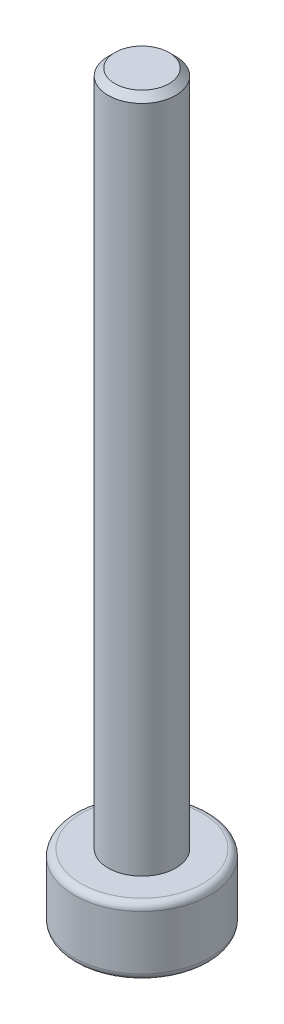
ISO-10303-21;
HEADER;
FILE_DESCRIPTION(('STEP AP214'),'2;1');
FILE_NAME('part.step','',(''),(''),'','','');
FILE_SCHEMA(('AUTOMOTIVE_DESIGN { 1 0 10303 214 1 1 1 1 }'));
ENDSEC;
DATA;
#1=APPLICATION_CONTEXT('core data for automotive mechanical design processes');
#2=APPLICATION_PROTOCOL_DEFINITION('international standard','automotive_design',2000,#1);
#3=PRODUCT_CONTEXT('',#1,'mechanical');
#4=PRODUCT('Part','Part','',(#3));
#5=PRODUCT_RELATED_PRODUCT_CATEGORY('part','',(#4));
#6=PRODUCT_DEFINITION_FORMATION('','',#4);
#7=PRODUCT_DEFINITION_CONTEXT('part definition',#1,'design');
#8=PRODUCT_DEFINITION('design','',#6,#7);
#9=PRODUCT_DEFINITION_SHAPE('','',#8);
#10=(LENGTH_UNIT() NAMED_UNIT(*) SI_UNIT(.MILLI.,.METRE.));
#11=(NAMED_UNIT(*) PLANE_ANGLE_UNIT() SI_UNIT($,.RADIAN.));
#12=(NAMED_UNIT(*) SI_UNIT($,.STERADIAN.) SOLID_ANGLE_UNIT());
#13=UNCERTAINTY_MEASURE_WITH_UNIT(LENGTH_MEASURE(1.E-05),#10,'distance_accuracy_value','');
#14=(GEOMETRIC_REPRESENTATION_CONTEXT(3) GLOBAL_UNCERTAINTY_ASSIGNED_CONTEXT((#13)) GLOBAL_UNIT_ASSIGNED_CONTEXT((#10,
#11,#12)) REPRESENTATION_CONTEXT('',''));
#15=CARTESIAN_POINT('',(0.,0.,0.));
#16=DIRECTION('',(0.,0.,1.));
#17=DIRECTION('',(1.,0.,0.));
#18=AXIS2_PLACEMENT_3D('',#15,#16,#17);
#19=CARTESIAN_POINT('',(0.,2.,0.));
#20=DIRECTION('',(0.,-1.,0.));
#21=DIRECTION('',(0.,0.,-1.));
#22=AXIS2_PLACEMENT_3D('',#19,#20,#21);
#23=CYLINDRICAL_SURFACE('',#22,2.);
#24=CARTESIAN_POINT('',(0.,0.2,0.));
#25=DIRECTION('',(0.,1.,0.));
#26=DIRECTION('',(0.,0.,1.));
#27=AXIS2_PLACEMENT_3D('',#24,#25,#26);
#28=CIRCLE('',#27,2.);
#29=CARTESIAN_POINT('',(0.,0.2,2.));
#30=VERTEX_POINT('',#29);
#31=EDGE_CURVE('E72',#30,#30,#28,.T.);
#32=ORIENTED_EDGE('',*,*,#31,.T.);
#33=EDGE_LOOP('',(#32));
#34=FACE_BOUND('',#33,.T.);
#35=CARTESIAN_POINT('',(0.,1.8,0.));
#36=DIRECTION('',(0.,1.,0.));
#37=DIRECTION('',(0.,0.,1.));
#38=AXIS2_PLACEMENT_3D('',#35,#36,#37);
#39=CIRCLE('',#38,2.);
#40=CARTESIAN_POINT('',(0.,1.8,2.));
#41=VERTEX_POINT('',#40);
#42=EDGE_CURVE('E76',#41,#41,#39,.F.);
#43=ORIENTED_EDGE('',*,*,#42,.T.);
#44=EDGE_LOOP('',(#43));
#45=FACE_BOUND('',#44,.T.);
#46=ADVANCED_FACE('F39',(#34,#45),#23,.T.);
#47=CARTESIAN_POINT('',(0.,2.,0.));
#48=DIRECTION('',(0.,1.,0.));
#49=DIRECTION('',(0.,0.,1.));
#50=AXIS2_PLACEMENT_3D('',#47,#48,#49);
#51=PLANE('',#50);
#52=CARTESIAN_POINT('',(0.,2.,0.));
#53=DIRECTION('',(0.,1.,0.));
#54=DIRECTION('',(0.,0.,1.));
#55=AXIS2_PLACEMENT_3D('',#52,#53,#54);
#56=CIRCLE('',#55,1.8);
#57=CARTESIAN_POINT('',(0.,2.,1.8));
#58=VERTEX_POINT('',#57);
#59=EDGE_CURVE('E64',#58,#58,#56,.T.);
#60=ORIENTED_EDGE('',*,*,#59,.T.);
#61=EDGE_LOOP('',(#60));
#62=FACE_BOUND('',#61,.T.);
#63=CARTESIAN_POINT('',(0.,2.,0.));
#64=DIRECTION('',(0.,1.,0.));
#65=DIRECTION('',(0.,0.,1.));
#66=AXIS2_PLACEMENT_3D('',#63,#64,#65);
#67=CIRCLE('',#66,1.);
#68=CARTESIAN_POINT('',(0.,2.,1.));
#69=VERTEX_POINT('',#68);
#70=EDGE_CURVE('E80',#69,#69,#67,.T.);
#71=ORIENTED_EDGE('',*,*,#70,.F.);
#72=EDGE_LOOP('',(#71));
#73=FACE_BOUND('',#72,.T.);
#74=ADVANCED_FACE('F107',(#62,#73),#51,.T.);
#75=CARTESIAN_POINT('',(0.,0.,0.));
#76=DIRECTION('',(0.,1.,0.));
#77=DIRECTION('',(0.,0.,1.));
#78=AXIS2_PLACEMENT_3D('',#75,#76,#77);
#79=PLANE('',#78);
#80=CARTESIAN_POINT('',(0.,0.,0.));
#81=DIRECTION('',(0.,1.,0.));
#82=DIRECTION('',(0.,0.,1.));
#83=AXIS2_PLACEMENT_3D('',#80,#81,#82);
#84=CIRCLE('',#83,0.864999999999998);
#85=CARTESIAN_POINT('',(0.,0.,-0.864999999999998));
#86=VERTEX_POINT('',#85);
#87=EDGE_CURVE('E53',#86,#86,#84,.T.);
#88=ORIENTED_EDGE('',*,*,#87,.T.);
#89=EDGE_LOOP('',(#88));
#90=FACE_BOUND('',#89,.T.);
#91=CARTESIAN_POINT('',(0.,0.,0.));
#92=DIRECTION('',(0.,1.,0.));
#93=DIRECTION('',(0.,0.,1.));
#94=AXIS2_PLACEMENT_3D('',#91,#92,#93);
#95=CIRCLE('',#94,1.8);
#96=CARTESIAN_POINT('',(0.,0.,1.8));
#97=VERTEX_POINT('',#96);
#98=EDGE_CURVE('E68',#97,#97,#95,.F.);
#99=ORIENTED_EDGE('',*,*,#98,.T.);
#100=EDGE_LOOP('',(#99));
#101=FACE_BOUND('',#100,.T.);
#102=ADVANCED_FACE('F113',(#90,#101),#79,.F.);
#103=CARTESIAN_POINT('',(0.,22.,0.));
#104=DIRECTION('',(0.,-1.,0.));
#105=DIRECTION('',(0.,0.,-1.));
#106=AXIS2_PLACEMENT_3D('',#103,#104,#105);
#107=CYLINDRICAL_SURFACE('',#106,1.);
#108=CARTESIAN_POINT('',(0.,21.8,0.));
#109=DIRECTION('',(0.,1.,0.));
#110=DIRECTION('',(0.,0.,1.));
#111=AXIS2_PLACEMENT_3D('',#108,#109,#110);
#112=CIRCLE('',#111,1.);
#113=CARTESIAN_POINT('',(0.,21.8,1.));
#114=VERTEX_POINT('',#113);
#115=EDGE_CURVE('E10',#114,#114,#112,.F.);
#116=ORIENTED_EDGE('',*,*,#115,.T.);
#117=EDGE_LOOP('',(#116));
#118=FACE_BOUND('',#117,.T.);
#119=ORIENTED_EDGE('',*,*,#70,.T.);
#120=EDGE_LOOP('',(#119));
#121=FACE_BOUND('',#120,.T.);
#122=ADVANCED_FACE('F137',(#118,#121),#107,.T.);
#123=CARTESIAN_POINT('',(0.,22.,0.));
#124=DIRECTION('',(0.,1.,0.));
#125=DIRECTION('',(0.,0.,1.));
#126=AXIS2_PLACEMENT_3D('',#123,#124,#125);
#127=PLANE('',#126);
#128=CARTESIAN_POINT('',(0.,22.,0.));
#129=DIRECTION('',(0.,1.,0.));
#130=DIRECTION('',(0.,0.,1.));
#131=AXIS2_PLACEMENT_3D('',#128,#129,#130);
#132=CIRCLE('',#131,0.800000000000002);
#133=CARTESIAN_POINT('',(0.,22.,0.800000000000002));
#134=VERTEX_POINT('',#133);
#135=EDGE_CURVE('E48',#134,#134,#132,.T.);
#136=ORIENTED_EDGE('',*,*,#135,.T.);
#137=EDGE_LOOP('',(#136));
#138=FACE_BOUND('',#137,.T.);
#139=ADVANCED_FACE('F120',(#138),#127,.T.);
#140=CARTESIAN_POINT('',(0.,0.2,0.));
#141=DIRECTION('',(0.,1.,0.));
#142=DIRECTION('',(0.,0.,1.));
#143=AXIS2_PLACEMENT_3D('',#140,#141,#142);
#144=TOROIDAL_SURFACE('',#143,1.8,0.2);
#145=ORIENTED_EDGE('',*,*,#98,.F.);
#146=EDGE_LOOP('',(#145));
#147=FACE_BOUND('',#146,.T.);
#148=ORIENTED_EDGE('',*,*,#31,.F.);
#149=EDGE_LOOP('',(#148));
#150=FACE_BOUND('',#149,.T.);
#151=ADVANCED_FACE('F102',(#147,#150),#144,.T.);
#152=CARTESIAN_POINT('',(0.,1.8,0.));
#153=DIRECTION('',(0.,1.,0.));
#154=DIRECTION('',(0.,0.,1.));
#155=AXIS2_PLACEMENT_3D('',#152,#153,#154);
#156=TOROIDAL_SURFACE('',#155,1.8,0.2);
#157=ORIENTED_EDGE('',*,*,#42,.F.);
#158=EDGE_LOOP('',(#157));
#159=FACE_BOUND('',#158,.T.);
#160=ORIENTED_EDGE('',*,*,#59,.F.);
#161=EDGE_LOOP('',(#160));
#162=FACE_BOUND('',#161,.T.);
#163=ADVANCED_FACE('F93',(#159,#162),#156,.T.);
#164=CARTESIAN_POINT('',(0.,1.52,0.));
#165=DIRECTION('',(0.,-1.,0.));
#166=DIRECTION('',(0.,0.,-1.));
#167=AXIS2_PLACEMENT_3D('',#164,#165,#166);
#168=CYLINDRICAL_SURFACE('',#167,0.765);
#169=CARTESIAN_POINT('',(0.,0.0999999999999968,0.));
#170=DIRECTION('',(0.,1.,0.));
#171=DIRECTION('',(0.,0.,1.));
#172=AXIS2_PLACEMENT_3D('',#169,#170,#171);
#173=CIRCLE('',#172,0.765);
#174=CARTESIAN_POINT('',(0.,0.0999999999999968,-0.765));
#175=VERTEX_POINT('',#174);
#176=EDGE_CURVE('E58',#175,#175,#173,.F.);
#177=ORIENTED_EDGE('',*,*,#176,.T.);
#178=EDGE_LOOP('',(#177));
#179=FACE_BOUND('',#178,.T.);
#180=CARTESIAN_POINT('',(0.,1.52,0.));
#181=DIRECTION('',(0.,-1.,0.));
#182=DIRECTION('',(0.,0.,-1.));
#183=AXIS2_PLACEMENT_3D('',#180,#181,#182);
#184=CIRCLE('',#183,0.765);
#185=CARTESIAN_POINT('',(0.,1.52,-0.765));
#186=VERTEX_POINT('',#185);
#187=EDGE_CURVE('E84',#186,#186,#184,.T.);
#188=ORIENTED_EDGE('',*,*,#187,.F.);
#189=EDGE_LOOP('',(#188));
#190=FACE_BOUND('',#189,.T.);
#191=ADVANCED_FACE('F91',(#179,#190),#168,.F.);
#192=CARTESIAN_POINT('',(0.,1.52,0.));
#193=DIRECTION('',(0.,-1.,0.));
#194=DIRECTION('',(0.,0.,-1.));
#195=AXIS2_PLACEMENT_3D('',#192,#193,#194);
#196=PLANE('',#195);
#197=ORIENTED_EDGE('',*,*,#187,.T.);
#198=EDGE_LOOP('',(#197));
#199=FACE_BOUND('',#198,.T.);
#200=ADVANCED_FACE('F89',(#199),#196,.T.);
#201=CARTESIAN_POINT('',(0.,0.0999999999999968,0.));
#202=DIRECTION('',(0.,-1.,0.));
#203=DIRECTION('',(0.,0.,-1.));
#204=AXIS2_PLACEMENT_3D('',#201,#202,#203);
#205=CONICAL_SURFACE('',#204,0.765,0.785398163397452);
#206=CARTESIAN_POINT('',(0.,0.,-0.864999999999998));
#207=CARTESIAN_POINT('',(0.,0.00104166666666665,-0.863958333333331));
#208=CARTESIAN_POINT('',(0.,0.00208333333333327,-0.862916666666664));
#209=CARTESIAN_POINT('',(0.,0.00416666666666652,-0.860833333333331));
#210=CARTESIAN_POINT('',(0.,0.00520833333333314,-0.859791666666664));
#211=CARTESIAN_POINT('',(0.,0.00729166666666641,-0.857708333333331));
#212=CARTESIAN_POINT('',(0.,0.00833333333333306,-0.856666666666665));
#213=CARTESIAN_POINT('',(0.,0.0104166666666663,-0.854583333333331));
#214=CARTESIAN_POINT('',(0.,0.0114583333333329,-0.853541666666665));
#215=CARTESIAN_POINT('',(0.,0.0135416666666662,-0.851458333333331));
#216=CARTESIAN_POINT('',(0.,0.0145833333333329,-0.850416666666665));
#217=CARTESIAN_POINT('',(0.,0.0166666666666661,-0.848333333333331));
#218=CARTESIAN_POINT('',(0.,0.0177083333333327,-0.847291666666665));
#219=CARTESIAN_POINT('',(0.,0.019791666666666,-0.845208333333331));
#220=CARTESIAN_POINT('',(0.,0.0208333333333326,-0.844166666666665));
#221=CARTESIAN_POINT('',(0.,0.0229166666666659,-0.842083333333332));
#222=CARTESIAN_POINT('',(0.,0.0239583333333326,-0.841041666666665));
#223=CARTESIAN_POINT('',(0.,0.0260416666666658,-0.838958333333332));
#224=CARTESIAN_POINT('',(0.,0.0270833333333325,-0.837916666666665));
#225=CARTESIAN_POINT('',(0.,0.0291666666666657,-0.835833333333332));
#226=CARTESIAN_POINT('',(0.,0.0302083333333323,-0.834791666666665));
#227=CARTESIAN_POINT('',(0.,0.0322916666666656,-0.832708333333332));
#228=CARTESIAN_POINT('',(0.,0.0333333333333322,-0.831666666666665));
#229=CARTESIAN_POINT('',(0.,0.0354166666666655,-0.829583333333332));
#230=CARTESIAN_POINT('',(0.,0.0364583333333322,-0.828541666666665));
#231=CARTESIAN_POINT('',(0.,0.0385416666666654,-0.826458333333332));
#232=CARTESIAN_POINT('',(0.,0.039583333333332,-0.825416666666665));
#233=CARTESIAN_POINT('',(0.,0.0416666666666653,-0.823333333333332));
#234=CARTESIAN_POINT('',(0.,0.042708333333332,-0.822291666666665));
#235=CARTESIAN_POINT('',(0.,0.0447916666666652,-0.820208333333332));
#236=CARTESIAN_POINT('',(0.,0.0458333333333319,-0.819166666666665));
#237=CARTESIAN_POINT('',(0.,0.0479166666666651,-0.817083333333332));
#238=CARTESIAN_POINT('',(0.,0.0489583333333318,-0.816041666666666));
#239=CARTESIAN_POINT('',(0.,0.051041666666665,-0.813958333333332));
#240=CARTESIAN_POINT('',(0.,0.0520833333333316,-0.812916666666666));
#241=CARTESIAN_POINT('',(0.,0.0541666666666649,-0.810833333333332));
#242=CARTESIAN_POINT('',(0.,0.0552083333333316,-0.809791666666666));
#243=CARTESIAN_POINT('',(0.,0.0572916666666648,-0.807708333333332));
#244=CARTESIAN_POINT('',(0.,0.0583333333333314,-0.806666666666666));
#245=CARTESIAN_POINT('',(0.,0.0604166666666647,-0.804583333333332));
#246=CARTESIAN_POINT('',(0.,0.0614583333333314,-0.803541666666666));
#247=CARTESIAN_POINT('',(0.,0.0635416666666646,-0.801458333333332));
#248=CARTESIAN_POINT('',(0.,0.0645833333333312,-0.800416666666666));
#249=CARTESIAN_POINT('',(0.,0.0666666666666645,-0.798333333333333));
#250=CARTESIAN_POINT('',(0.,0.0677083333333312,-0.797291666666666));
#251=CARTESIAN_POINT('',(0.,0.0697916666666644,-0.795208333333333));
#252=CARTESIAN_POINT('',(0.,0.070833333333331,-0.794166666666666));
#253=CARTESIAN_POINT('',(0.,0.0729166666666643,-0.792083333333333));
#254=CARTESIAN_POINT('',(0.,0.073958333333331,-0.791041666666666));
#255=CARTESIAN_POINT('',(0.,0.0760416666666642,-0.788958333333333));
#256=CARTESIAN_POINT('',(0.,0.0770833333333309,-0.787916666666666));
#257=CARTESIAN_POINT('',(0.,0.0791666666666641,-0.785833333333333));
#258=CARTESIAN_POINT('',(0.,0.0802083333333308,-0.784791666666666));
#259=CARTESIAN_POINT('',(0.,0.082291666666664,-0.782708333333333));
#260=CARTESIAN_POINT('',(0.,0.0833333333333307,-0.781666666666666));
#261=CARTESIAN_POINT('',(0.,0.0854166666666639,-0.779583333333333));
#262=CARTESIAN_POINT('',(0.,0.0864583333333306,-0.778541666666666));
#263=CARTESIAN_POINT('',(0.,0.0885416666666638,-0.776458333333333));
#264=CARTESIAN_POINT('',(0.,0.0895833333333304,-0.775416666666666));
#265=CARTESIAN_POINT('',(0.,0.0916666666666637,-0.773333333333333));
#266=CARTESIAN_POINT('',(0.,0.0927083333333304,-0.772291666666667));
#267=CARTESIAN_POINT('',(0.,0.0947916666666636,-0.770208333333333));
#268=CARTESIAN_POINT('',(0.,0.0958333333333303,-0.769166666666667));
#269=CARTESIAN_POINT('',(0.,0.0979166666666635,-0.767083333333333));
#270=CARTESIAN_POINT('',(0.,0.0989583333333301,-0.766041666666667));
#271=CARTESIAN_POINT('',(0.,0.0999999999999968,-0.765));
#272=B_SPLINE_CURVE_WITH_KNOTS('',3,(#206,#207,#208,#209,#210,#211,#212,#213,#214,#215,#216,
#217,#218,#219,#220,#221,#222,#223,#224,#225,#226,#227,#228,#229,#230,#231,#232,#233,#234,#235,
#236,#237,#238,#239,#240,#241,#242,#243,#244,#245,#246,#247,#248,#249,#250,#251,#252,#253,#254,
#255,#256,#257,#258,#259,#260,#261,#262,#263,#264,#265,#266,#267,#268,#269,#270,#271),
.UNSPECIFIED.,.F.,.F.,(4,2,2,2,2,2,2,2,2,2,2,2,2,2,2,2,2,2,2,2,2,2,2,2,2,2,2,2,2,2,2,2,4),(0.,
0.00441941738241576,0.0088388347648316,0.0132582521472474,0.0176776695296632,0.022097086912079,
0.0265165042944948,0.0309359216769106,0.0353553390593263,0.0397747564417422,0.044194173824158,
0.0486135912065737,0.0530330085889895,0.0574524259714054,0.0618718433538211,0.066291260736237,
0.0707106781186527,0.0751300955010686,0.0795495128834843,0.0839689302659001,0.0883883476483159,
0.0928077650307318,0.0972271824131475,0.101646599795563,0.106066017177979,0.110485434560395,
0.114904851942811,0.119324269325227,0.123743686707642,0.128163104090058,0.132582521472474,
0.13700193885489,0.141421356237306),.UNSPECIFIED.);
#273=EDGE_CURVE('BSEAM100',#86,#175,#272,.T.);
#274=ORIENTED_EDGE('',*,*,#87,.F.);
#275=ORIENTED_EDGE('',*,*,#176,.F.);
#276=ORIENTED_EDGE('',*,*,#273,.T.);
#277=ORIENTED_EDGE('',*,*,#273,.F.);
#278=EDGE_LOOP('',(#274,#276,#275,#277));
#279=FACE_BOUND('',#278,.T.);
#280=ADVANCED_FACE('F100',(#279),#205,.F.);
#281=CARTESIAN_POINT('',(0.,22.,0.));
#282=DIRECTION('',(0.,-1.,0.));
#283=DIRECTION('',(0.,0.,-1.));
#284=AXIS2_PLACEMENT_3D('',#281,#282,#283);
#285=CONICAL_SURFACE('',#284,0.800000000000002,0.785398163397455);
#286=ORIENTED_EDGE('',*,*,#115,.F.);
#287=EDGE_LOOP('',(#286));
#288=FACE_BOUND('',#287,.T.);
#289=ORIENTED_EDGE('',*,*,#135,.F.);
#290=EDGE_LOOP('',(#289));
#291=FACE_BOUND('',#290,.T.);
#292=ADVANCED_FACE('F42',(#288,#291),#285,.T.);
#293=CLOSED_SHELL('',(#46,#74,#102,#122,#139,#151,#163,#191,#200,#280,#292));
#294=MANIFOLD_SOLID_BREP('B2',#293);
#295=ADVANCED_BREP_SHAPE_REPRESENTATION('',(#18,#294),#14);
#296=SHAPE_DEFINITION_REPRESENTATION(#9,#295);
ENDSEC;
END-ISO-10303-21;
